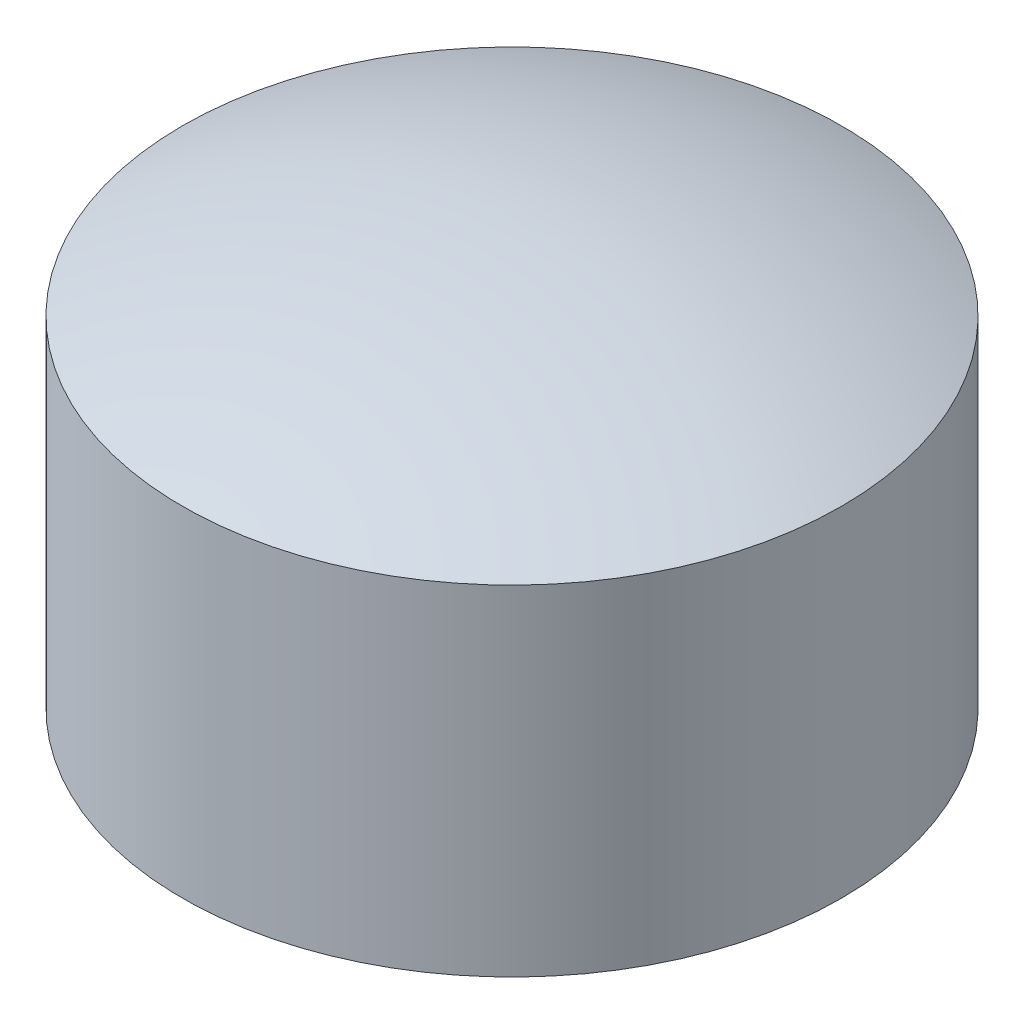
ISO-10303-21;
HEADER;
FILE_DESCRIPTION(('STEP AP214'),'2;1');
FILE_NAME('part.step','',(''),(''),'','','');
FILE_SCHEMA(('AUTOMOTIVE_DESIGN { 1 0 10303 214 1 1 1 1 }'));
ENDSEC;
DATA;
#1=APPLICATION_CONTEXT('core data for automotive mechanical design processes');
#2=APPLICATION_PROTOCOL_DEFINITION('international standard','automotive_design',2000,#1);
#3=PRODUCT_CONTEXT('',#1,'mechanical');
#4=PRODUCT('Part','Part','',(#3));
#5=PRODUCT_RELATED_PRODUCT_CATEGORY('part','',(#4));
#6=PRODUCT_DEFINITION_FORMATION('','',#4);
#7=PRODUCT_DEFINITION_CONTEXT('part definition',#1,'design');
#8=PRODUCT_DEFINITION('design','',#6,#7);
#9=PRODUCT_DEFINITION_SHAPE('','',#8);
#10=(LENGTH_UNIT() NAMED_UNIT(*) SI_UNIT(.MILLI.,.METRE.));
#11=(NAMED_UNIT(*) PLANE_ANGLE_UNIT() SI_UNIT($,.RADIAN.));
#12=(NAMED_UNIT(*) SI_UNIT($,.STERADIAN.) SOLID_ANGLE_UNIT());
#13=UNCERTAINTY_MEASURE_WITH_UNIT(LENGTH_MEASURE(1.E-05),#10,'distance_accuracy_value','');
#14=(GEOMETRIC_REPRESENTATION_CONTEXT(3) GLOBAL_UNCERTAINTY_ASSIGNED_CONTEXT((#13)) GLOBAL_UNIT_ASSIGNED_CONTEXT((#10,
#11,#12)) REPRESENTATION_CONTEXT('',''));
#15=CARTESIAN_POINT('',(0.,0.,0.));
#16=DIRECTION('',(0.,0.,1.));
#17=DIRECTION('',(1.,0.,0.));
#18=AXIS2_PLACEMENT_3D('',#15,#16,#17);
#19=CARTESIAN_POINT('',(83.5,-54.8953151990859,0.));
#20=DIRECTION('',(0.,1.,0.));
#21=DIRECTION('',(-1.,0.,0.));
#22=AXIS2_PLACEMENT_3D('',#19,#20,#21);
#23=PLANE('',#22);
#24=CARTESIAN_POINT('',(0.,-54.8953151990859,0.));
#25=DIRECTION('',(0.,1.,0.));
#26=DIRECTION('',(-1.,0.,0.));
#27=AXIS2_PLACEMENT_3D('',#24,#25,#26);
#28=CIRCLE('',#27,83.5);
#29=CARTESIAN_POINT('',(-83.5,-54.8953151990859,0.));
#30=VERTEX_POINT('',#29);
#31=EDGE_CURVE('E11',#30,#30,#28,.T.);
#32=ORIENTED_EDGE('',*,*,#31,.F.);
#33=EDGE_LOOP('',(#32));
#34=FACE_BOUND('',#33,.T.);
#35=CARTESIAN_POINT('',(0.,-54.8953151990859,0.));
#36=DIRECTION('',(0.,1.,0.));
#37=DIRECTION('',(-1.,0.,0.));
#38=AXIS2_PLACEMENT_3D('',#35,#36,#37);
#39=CIRCLE('',#38,80.);
#40=CARTESIAN_POINT('',(-80.,-54.8953151990859,0.));
#41=VERTEX_POINT('',#40);
#42=EDGE_CURVE('E68',#41,#41,#39,.T.);
#43=ORIENTED_EDGE('',*,*,#42,.T.);
#44=EDGE_LOOP('',(#43));
#45=FACE_BOUND('',#44,.T.);
#46=ADVANCED_FACE('F32',(#34,#45),#23,.F.);
#47=CARTESIAN_POINT('',(0.,67.6045539622283,0.));
#48=DIRECTION('',(0.,1.,0.));
#49=DIRECTION('',(-1.,0.,0.));
#50=AXIS2_PLACEMENT_3D('',#47,#48,#49);
#51=CYLINDRICAL_SURFACE('',#50,83.5);
#52=CARTESIAN_POINT('',(0.,31.1046848009141,0.));
#53=DIRECTION('',(0.,1.,0.));
#54=DIRECTION('',(-1.,0.,0.));
#55=AXIS2_PLACEMENT_3D('',#52,#53,#54);
#56=CIRCLE('',#55,83.5);
#57=CARTESIAN_POINT('',(-83.5,31.104684800914,0.));
#58=VERTEX_POINT('',#57);
#59=EDGE_CURVE('E38',#58,#58,#56,.T.);
#60=ORIENTED_EDGE('',*,*,#59,.F.);
#61=EDGE_LOOP('',(#60));
#62=FACE_BOUND('',#61,.T.);
#63=ORIENTED_EDGE('',*,*,#31,.T.);
#64=EDGE_LOOP('',(#63));
#65=FACE_BOUND('',#64,.T.);
#66=ADVANCED_FACE('F53',(#62,#65),#51,.T.);
#67=CARTESIAN_POINT('',(0.,-153.568926310197,0.));
#68=DIRECTION('',(0.,1.,0.));
#69=DIRECTION('',(1.,0.,0.));
#70=AXIS2_PLACEMENT_3D('',#67,#68,#69);
#71=SPHERICAL_SURFACE('',#70,202.673611111111);
#72=ORIENTED_EDGE('',*,*,#59,.T.);
#73=EDGE_LOOP('',(#72));
#74=FACE_BOUND('',#73,.T.);
#75=ADVANCED_FACE('F44',(#74),#71,.T.);
#76=CARTESIAN_POINT('',(0.,45.5797257792712,0.));
#77=CARTESIAN_POINT('',(39.9999999999902,45.5797257792673,0.));
#78=CARTESIAN_POINT('',(80.,29.1093085711609,0.));
#79=B_SPLINE_CURVE_WITH_KNOTS('',2,(#76,#77,#78),.UNSPECIFIED.,.F.,.F.,(3,3),(0.500000000000122,
1.),.UNSPECIFIED.);
#80=CARTESIAN_POINT('',(0.,67.6045539622283,0.));
#81=DIRECTION('',(0.,1.,0.));
#82=AXIS1_PLACEMENT('',#80,#81);
#83=SURFACE_OF_REVOLUTION('',#79,#82);
#84=CARTESIAN_POINT('',(0.,29.1093085711608,0.));
#85=DIRECTION('',(0.,1.,0.));
#86=DIRECTION('',(-1.,0.,0.));
#87=AXIS2_PLACEMENT_3D('',#84,#85,#86);
#88=CIRCLE('',#87,80.);
#89=CARTESIAN_POINT('',(-80.,29.1093085711608,0.));
#90=VERTEX_POINT('',#89);
#91=EDGE_CURVE('E69',#90,#90,#88,.T.);
#92=ORIENTED_EDGE('',*,*,#91,.F.);
#93=EDGE_LOOP('',(#92));
#94=FACE_BOUND('',#93,.T.);
#95=CARTESIAN_POINT('',(0.,45.5797257792712,0.));
#96=VERTEX_POINT('',#95);
#97=VERTEX_LOOP('',#96);
#98=FACE_BOUND('',#97,.T.);
#99=ADVANCED_FACE('F41',(#94,#98),#83,.T.);
#100=CARTESIAN_POINT('',(0.,67.6045539622283,0.));
#101=DIRECTION('',(0.,1.,0.));
#102=DIRECTION('',(-1.,0.,0.));
#103=AXIS2_PLACEMENT_3D('',#100,#101,#102);
#104=CYLINDRICAL_SURFACE('',#103,80.);
#105=ORIENTED_EDGE('',*,*,#42,.F.);
#106=EDGE_LOOP('',(#105));
#107=FACE_BOUND('',#106,.T.);
#108=ORIENTED_EDGE('',*,*,#91,.T.);
#109=EDGE_LOOP('',(#108));
#110=FACE_BOUND('',#109,.T.);
#111=ADVANCED_FACE('F43',(#107,#110),#104,.F.);
#112=CLOSED_SHELL('',(#46,#66,#75,#99,#111));
#113=MANIFOLD_SOLID_BREP('B2',#112);
#114=ADVANCED_BREP_SHAPE_REPRESENTATION('',(#18,#113),#14);
#115=SHAPE_DEFINITION_REPRESENTATION(#9,#114);
ENDSEC;
END-ISO-10303-21;
